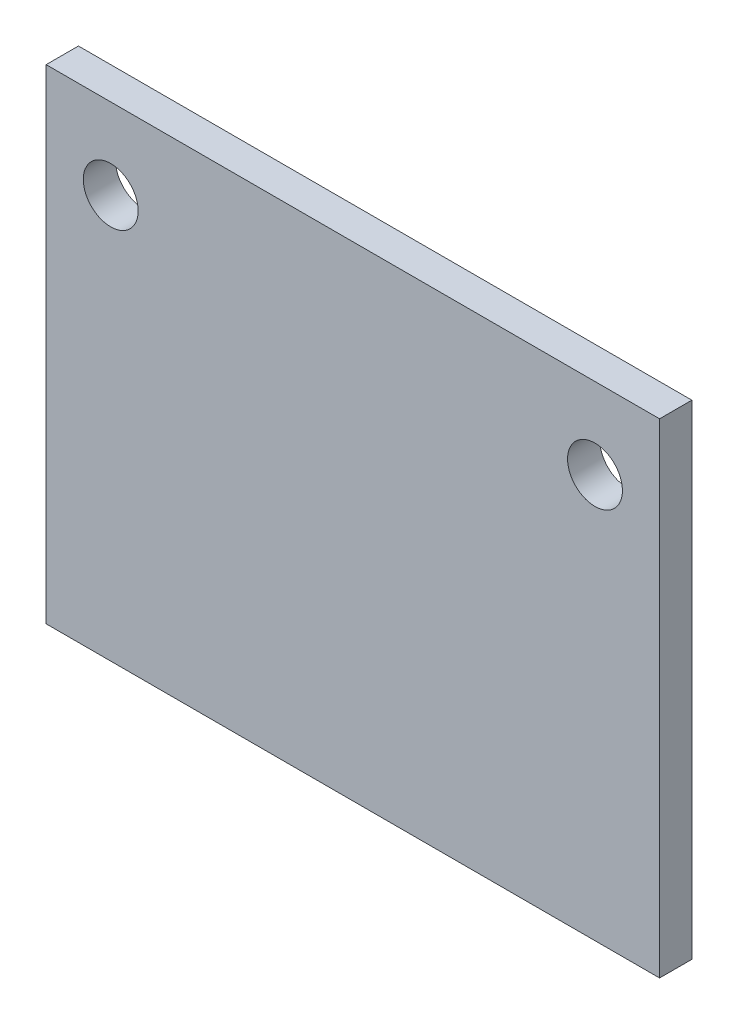
ISO-10303-21;
HEADER;
FILE_DESCRIPTION(('STEP AP214'),'2;1');
FILE_NAME('part.step','',(''),(''),'','','');
FILE_SCHEMA(('AUTOMOTIVE_DESIGN { 1 0 10303 214 1 1 1 1 }'));
ENDSEC;
DATA;
#1=APPLICATION_CONTEXT('core data for automotive mechanical design processes');
#2=APPLICATION_PROTOCOL_DEFINITION('international standard','automotive_design',2000,#1);
#3=PRODUCT_CONTEXT('',#1,'mechanical');
#4=PRODUCT('Part','Part','',(#3));
#5=PRODUCT_RELATED_PRODUCT_CATEGORY('part','',(#4));
#6=PRODUCT_DEFINITION_FORMATION('','',#4);
#7=PRODUCT_DEFINITION_CONTEXT('part definition',#1,'design');
#8=PRODUCT_DEFINITION('design','',#6,#7);
#9=PRODUCT_DEFINITION_SHAPE('','',#8);
#10=(LENGTH_UNIT() NAMED_UNIT(*) SI_UNIT(.MILLI.,.METRE.));
#11=(NAMED_UNIT(*) PLANE_ANGLE_UNIT() SI_UNIT($,.RADIAN.));
#12=(NAMED_UNIT(*) SI_UNIT($,.STERADIAN.) SOLID_ANGLE_UNIT());
#13=UNCERTAINTY_MEASURE_WITH_UNIT(LENGTH_MEASURE(1.E-05),#10,'distance_accuracy_value','');
#14=(GEOMETRIC_REPRESENTATION_CONTEXT(3) GLOBAL_UNCERTAINTY_ASSIGNED_CONTEXT((#13)) GLOBAL_UNIT_ASSIGNED_CONTEXT((#10,
#11,#12)) REPRESENTATION_CONTEXT('',''));
#15=CARTESIAN_POINT('',(0.,0.,0.));
#16=DIRECTION('',(0.,0.,1.));
#17=DIRECTION('',(1.,0.,0.));
#18=AXIS2_PLACEMENT_3D('',#15,#16,#17);
#19=CARTESIAN_POINT('',(19.,15.,0.));
#20=DIRECTION('',(0.,1.,0.));
#21=DIRECTION('',(-1.,0.,0.));
#22=AXIS2_PLACEMENT_3D('',#19,#20,#21);
#23=PLANE('',#22);
#24=DIRECTION('',(-1.,0.,0.));
#25=VECTOR('',#24,1.);
#26=CARTESIAN_POINT('',(19.,15.,2.));
#27=LINE('',#26,#25);
#28=CARTESIAN_POINT('',(19.,15.,2.));
#29=VERTEX_POINT('',#28);
#30=CARTESIAN_POINT('',(-19.,15.,2.));
#31=VERTEX_POINT('',#30);
#32=EDGE_CURVE('E95',#29,#31,#27,.T.);
#33=ORIENTED_EDGE('',*,*,#32,.F.);
#34=DIRECTION('',(0.,0.,1.));
#35=VECTOR('',#34,1.);
#36=CARTESIAN_POINT('',(19.,15.,0.));
#37=LINE('',#36,#35);
#38=CARTESIAN_POINT('',(19.,15.,0.));
#39=VERTEX_POINT('',#38);
#40=EDGE_CURVE('E11',#39,#29,#37,.T.);
#41=ORIENTED_EDGE('',*,*,#40,.F.);
#42=DIRECTION('',(-1.,0.,0.));
#43=VECTOR('',#42,1.);
#44=CARTESIAN_POINT('',(19.,15.,0.));
#45=LINE('',#44,#43);
#46=CARTESIAN_POINT('',(-19.,15.,0.));
#47=VERTEX_POINT('',#46);
#48=EDGE_CURVE('E88',#39,#47,#45,.T.);
#49=ORIENTED_EDGE('',*,*,#48,.T.);
#50=DIRECTION('',(0.,0.,1.));
#51=VECTOR('',#50,1.);
#52=CARTESIAN_POINT('',(-19.,15.,0.));
#53=LINE('',#52,#51);
#54=EDGE_CURVE('E33',#47,#31,#53,.T.);
#55=ORIENTED_EDGE('',*,*,#54,.T.);
#56=EDGE_LOOP('',(#33,#41,#49,#55));
#57=FACE_BOUND('',#56,.T.);
#58=ADVANCED_FACE('F30',(#57),#23,.T.);
#59=CARTESIAN_POINT('',(19.,-15.,0.));
#60=DIRECTION('',(1.,0.,0.));
#61=DIRECTION('',(0.,1.,0.));
#62=AXIS2_PLACEMENT_3D('',#59,#60,#61);
#63=PLANE('',#62);
#64=DIRECTION('',(0.,1.,0.));
#65=VECTOR('',#64,1.);
#66=CARTESIAN_POINT('',(19.,-15.,2.));
#67=LINE('',#66,#65);
#68=CARTESIAN_POINT('',(19.,-15.,2.));
#69=VERTEX_POINT('',#68);
#70=EDGE_CURVE('E90',#69,#29,#67,.T.);
#71=ORIENTED_EDGE('',*,*,#70,.F.);
#72=DIRECTION('',(0.,0.,1.));
#73=VECTOR('',#72,1.);
#74=CARTESIAN_POINT('',(19.,-15.,0.));
#75=LINE('',#74,#73);
#76=CARTESIAN_POINT('',(19.,-15.,0.));
#77=VERTEX_POINT('',#76);
#78=EDGE_CURVE('E39',#77,#69,#75,.T.);
#79=ORIENTED_EDGE('',*,*,#78,.F.);
#80=DIRECTION('',(0.,1.,0.));
#81=VECTOR('',#80,1.);
#82=CARTESIAN_POINT('',(19.,-15.,0.));
#83=LINE('',#82,#81);
#84=EDGE_CURVE('E85',#77,#39,#83,.T.);
#85=ORIENTED_EDGE('',*,*,#84,.T.);
#86=ORIENTED_EDGE('',*,*,#40,.T.);
#87=EDGE_LOOP('',(#71,#79,#85,#86));
#88=FACE_BOUND('',#87,.T.);
#89=ADVANCED_FACE('F106',(#88),#63,.T.);
#90=CARTESIAN_POINT('',(-19.,-15.,0.));
#91=DIRECTION('',(0.,-1.,0.));
#92=DIRECTION('',(0.,0.,-1.));
#93=AXIS2_PLACEMENT_3D('',#90,#91,#92);
#94=PLANE('',#93);
#95=DIRECTION('',(1.,0.,0.));
#96=VECTOR('',#95,1.);
#97=CARTESIAN_POINT('',(-19.,-15.,2.));
#98=LINE('',#97,#96);
#99=CARTESIAN_POINT('',(-19.,-15.,2.));
#100=VERTEX_POINT('',#99);
#101=EDGE_CURVE('E80',#100,#69,#98,.T.);
#102=ORIENTED_EDGE('',*,*,#101,.F.);
#103=DIRECTION('',(0.,0.,1.));
#104=VECTOR('',#103,1.);
#105=CARTESIAN_POINT('',(-19.,-15.,0.));
#106=LINE('',#105,#104);
#107=CARTESIAN_POINT('',(-19.,-15.,0.));
#108=VERTEX_POINT('',#107);
#109=EDGE_CURVE('E75',#108,#100,#106,.T.);
#110=ORIENTED_EDGE('',*,*,#109,.F.);
#111=DIRECTION('',(1.,0.,0.));
#112=VECTOR('',#111,1.);
#113=CARTESIAN_POINT('',(-19.,-15.,0.));
#114=LINE('',#113,#112);
#115=EDGE_CURVE('E78',#108,#77,#114,.T.);
#116=ORIENTED_EDGE('',*,*,#115,.T.);
#117=ORIENTED_EDGE('',*,*,#78,.T.);
#118=EDGE_LOOP('',(#102,#110,#116,#117));
#119=FACE_BOUND('',#118,.T.);
#120=ADVANCED_FACE('F77',(#119),#94,.T.);
#121=CARTESIAN_POINT('',(-19.,15.,0.));
#122=DIRECTION('',(-1.,0.,0.));
#123=DIRECTION('',(0.,-1.,0.));
#124=AXIS2_PLACEMENT_3D('',#121,#122,#123);
#125=PLANE('',#124);
#126=DIRECTION('',(0.,-1.,0.));
#127=VECTOR('',#126,1.);
#128=CARTESIAN_POINT('',(-19.,15.,2.));
#129=LINE('',#128,#127);
#130=EDGE_CURVE('E98',#31,#100,#129,.T.);
#131=ORIENTED_EDGE('',*,*,#130,.F.);
#132=ORIENTED_EDGE('',*,*,#54,.F.);
#133=DIRECTION('',(0.,-1.,0.));
#134=VECTOR('',#133,1.);
#135=CARTESIAN_POINT('',(-19.,15.,0.));
#136=LINE('',#135,#134);
#137=EDGE_CURVE('E84',#47,#108,#136,.T.);
#138=ORIENTED_EDGE('',*,*,#137,.T.);
#139=ORIENTED_EDGE('',*,*,#109,.T.);
#140=EDGE_LOOP('',(#131,#132,#138,#139));
#141=FACE_BOUND('',#140,.T.);
#142=ADVANCED_FACE('F87',(#141),#125,.T.);
#143=CARTESIAN_POINT('',(-19.,15.,0.));
#144=DIRECTION('',(0.,0.,1.));
#145=DIRECTION('',(1.,0.,0.));
#146=AXIS2_PLACEMENT_3D('',#143,#144,#145);
#147=PLANE('',#146);
#148=CARTESIAN_POINT('',(-15.,9.99689234184242,0.));
#149=DIRECTION('',(0.,0.,1.));
#150=DIRECTION('',(-1.,0.,0.));
#151=AXIS2_PLACEMENT_3D('',#148,#149,#150);
#152=CIRCLE('',#151,1.7);
#153=CARTESIAN_POINT('',(-16.7,9.99689234184242,0.));
#154=VERTEX_POINT('',#153);
#155=EDGE_CURVE('E139',#154,#154,#152,.T.);
#156=ORIENTED_EDGE('',*,*,#155,.T.);
#157=EDGE_LOOP('',(#156));
#158=FACE_BOUND('',#157,.T.);
#159=CARTESIAN_POINT('',(15.,9.99689234184242,0.));
#160=DIRECTION('',(0.,0.,1.));
#161=DIRECTION('',(-1.,0.,0.));
#162=AXIS2_PLACEMENT_3D('',#159,#160,#161);
#163=CIRCLE('',#162,1.7);
#164=CARTESIAN_POINT('',(13.3,9.99689234184242,0.));
#165=VERTEX_POINT('',#164);
#166=EDGE_CURVE('E99',#165,#165,#163,.T.);
#167=ORIENTED_EDGE('',*,*,#166,.T.);
#168=EDGE_LOOP('',(#167));
#169=FACE_BOUND('',#168,.T.);
#170=ORIENTED_EDGE('',*,*,#48,.F.);
#171=ORIENTED_EDGE('',*,*,#84,.F.);
#172=ORIENTED_EDGE('',*,*,#115,.F.);
#173=ORIENTED_EDGE('',*,*,#137,.F.);
#174=EDGE_LOOP('',(#170,#171,#172,#173));
#175=FACE_BOUND('',#174,.T.);
#176=ADVANCED_FACE('F83',(#158,#169,#175),#147,.F.);
#177=CARTESIAN_POINT('',(-19.,15.,2.));
#178=DIRECTION('',(0.,0.,1.));
#179=DIRECTION('',(1.,0.,0.));
#180=AXIS2_PLACEMENT_3D('',#177,#178,#179);
#181=PLANE('',#180);
#182=CARTESIAN_POINT('',(-15.,9.99689234184242,2.));
#183=DIRECTION('',(0.,0.,1.));
#184=DIRECTION('',(-1.,0.,0.));
#185=AXIS2_PLACEMENT_3D('',#182,#183,#184);
#186=CIRCLE('',#185,1.7);
#187=CARTESIAN_POINT('',(-16.7,9.99689234184242,2.));
#188=VERTEX_POINT('',#187);
#189=EDGE_CURVE('E142',#188,#188,#186,.T.);
#190=ORIENTED_EDGE('',*,*,#189,.F.);
#191=EDGE_LOOP('',(#190));
#192=FACE_BOUND('',#191,.T.);
#193=CARTESIAN_POINT('',(15.,9.99689234184242,2.));
#194=DIRECTION('',(0.,0.,1.));
#195=DIRECTION('',(-1.,0.,0.));
#196=AXIS2_PLACEMENT_3D('',#193,#194,#195);
#197=CIRCLE('',#196,1.7);
#198=CARTESIAN_POINT('',(13.3,9.99689234184242,2.));
#199=VERTEX_POINT('',#198);
#200=EDGE_CURVE('E144',#199,#199,#197,.T.);
#201=ORIENTED_EDGE('',*,*,#200,.F.);
#202=EDGE_LOOP('',(#201));
#203=FACE_BOUND('',#202,.T.);
#204=ORIENTED_EDGE('',*,*,#32,.T.);
#205=ORIENTED_EDGE('',*,*,#130,.T.);
#206=ORIENTED_EDGE('',*,*,#101,.T.);
#207=ORIENTED_EDGE('',*,*,#70,.T.);
#208=EDGE_LOOP('',(#204,#205,#206,#207));
#209=FACE_BOUND('',#208,.T.);
#210=ADVANCED_FACE('F105',(#192,#203,#209),#181,.T.);
#211=CARTESIAN_POINT('',(15.,9.99689234184242,0.));
#212=DIRECTION('',(0.,0.,1.));
#213=DIRECTION('',(1.,0.,0.));
#214=AXIS2_PLACEMENT_3D('',#211,#212,#213);
#215=CYLINDRICAL_SURFACE('',#214,1.7);
#216=ORIENTED_EDGE('',*,*,#166,.F.);
#217=EDGE_LOOP('',(#216));
#218=FACE_BOUND('',#217,.T.);
#219=ORIENTED_EDGE('',*,*,#200,.T.);
#220=EDGE_LOOP('',(#219));
#221=FACE_BOUND('',#220,.T.);
#222=ADVANCED_FACE('F124',(#218,#221),#215,.F.);
#223=CARTESIAN_POINT('',(-15.,9.99689234184242,0.));
#224=DIRECTION('',(0.,0.,1.));
#225=DIRECTION('',(1.,0.,0.));
#226=AXIS2_PLACEMENT_3D('',#223,#224,#225);
#227=CYLINDRICAL_SURFACE('',#226,1.7);
#228=ORIENTED_EDGE('',*,*,#155,.F.);
#229=EDGE_LOOP('',(#228));
#230=FACE_BOUND('',#229,.T.);
#231=ORIENTED_EDGE('',*,*,#189,.T.);
#232=EDGE_LOOP('',(#231));
#233=FACE_BOUND('',#232,.T.);
#234=ADVANCED_FACE('F131',(#230,#233),#227,.F.);
#235=CLOSED_SHELL('',(#58,#89,#120,#142,#176,#210,#222,#234));
#236=MANIFOLD_SOLID_BREP('B2',#235);
#237=ADVANCED_BREP_SHAPE_REPRESENTATION('',(#18,#236),#14);
#238=SHAPE_DEFINITION_REPRESENTATION(#9,#237);
ENDSEC;
END-ISO-10303-21;
